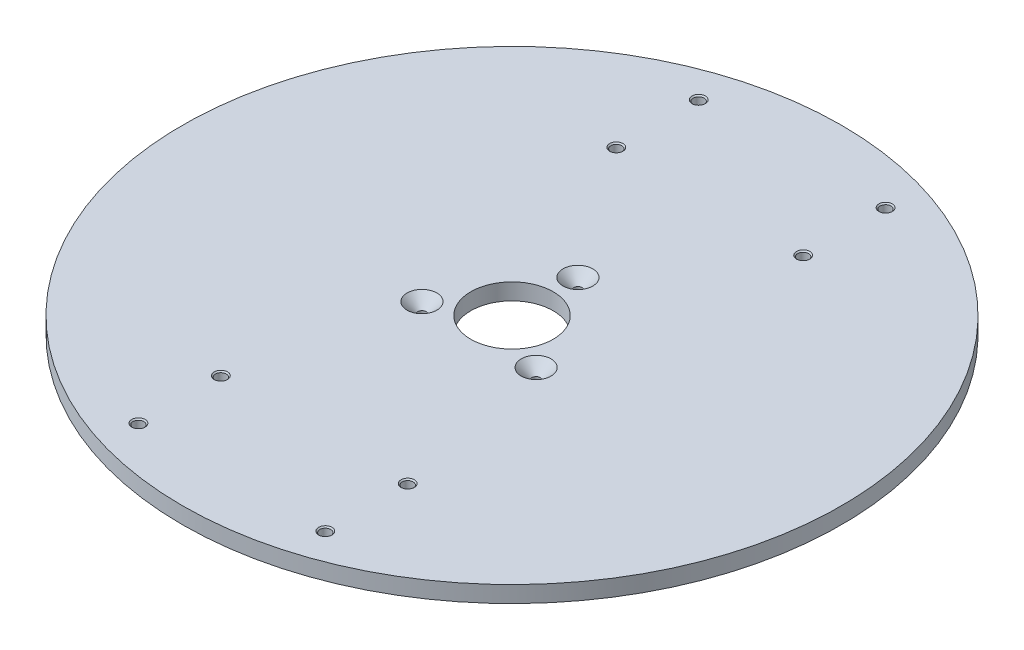
ISO-10303-21;
HEADER;
FILE_DESCRIPTION(('STEP AP214'),'2;1');
FILE_NAME('part.step','',(''),(''),'','','');
FILE_SCHEMA(('AUTOMOTIVE_DESIGN { 1 0 10303 214 1 1 1 1 }'));
ENDSEC;
DATA;
#1=APPLICATION_CONTEXT('core data for automotive mechanical design processes');
#2=APPLICATION_PROTOCOL_DEFINITION('international standard','automotive_design',2000,#1);
#3=PRODUCT_CONTEXT('',#1,'mechanical');
#4=PRODUCT('Part','Part','',(#3));
#5=PRODUCT_RELATED_PRODUCT_CATEGORY('part','',(#4));
#6=PRODUCT_DEFINITION_FORMATION('','',#4);
#7=PRODUCT_DEFINITION_CONTEXT('part definition',#1,'design');
#8=PRODUCT_DEFINITION('design','',#6,#7);
#9=PRODUCT_DEFINITION_SHAPE('','',#8);
#10=(LENGTH_UNIT() NAMED_UNIT(*) SI_UNIT(.MILLI.,.METRE.));
#11=(NAMED_UNIT(*) PLANE_ANGLE_UNIT() SI_UNIT($,.RADIAN.));
#12=(NAMED_UNIT(*) SI_UNIT($,.STERADIAN.) SOLID_ANGLE_UNIT());
#13=UNCERTAINTY_MEASURE_WITH_UNIT(LENGTH_MEASURE(1.E-05),#10,'distance_accuracy_value','');
#14=(GEOMETRIC_REPRESENTATION_CONTEXT(3) GLOBAL_UNCERTAINTY_ASSIGNED_CONTEXT((#13)) GLOBAL_UNIT_ASSIGNED_CONTEXT((#10,
#11,#12)) REPRESENTATION_CONTEXT('',''));
#15=CARTESIAN_POINT('',(0.,0.,0.));
#16=DIRECTION('',(0.,0.,1.));
#17=DIRECTION('',(1.,0.,0.));
#18=AXIS2_PLACEMENT_3D('',#15,#16,#17);
#19=CARTESIAN_POINT('',(0.,5.,0.));
#20=DIRECTION('',(0.,-1.,0.));
#21=DIRECTION('',(0.,0.,-1.));
#22=AXIS2_PLACEMENT_3D('',#19,#20,#21);
#23=CYLINDRICAL_SURFACE('',#22,100.);
#24=CARTESIAN_POINT('',(0.,5.,0.));
#25=DIRECTION('',(0.,1.,0.));
#26=DIRECTION('',(0.,0.,1.));
#27=AXIS2_PLACEMENT_3D('',#24,#25,#26);
#28=CIRCLE('',#27,100.);
#29=CARTESIAN_POINT('',(0.,5.,100.));
#30=VERTEX_POINT('',#29);
#31=EDGE_CURVE('E10',#30,#30,#28,.T.);
#32=ORIENTED_EDGE('',*,*,#31,.F.);
#33=EDGE_LOOP('',(#32));
#34=FACE_BOUND('',#33,.T.);
#35=CARTESIAN_POINT('',(0.,0.,0.));
#36=DIRECTION('',(0.,1.,0.));
#37=DIRECTION('',(0.,0.,1.));
#38=AXIS2_PLACEMENT_3D('',#35,#36,#37);
#39=CIRCLE('',#38,100.);
#40=CARTESIAN_POINT('',(0.,0.,100.));
#41=VERTEX_POINT('',#40);
#42=EDGE_CURVE('E42',#41,#41,#39,.T.);
#43=ORIENTED_EDGE('',*,*,#42,.T.);
#44=EDGE_LOOP('',(#43));
#45=FACE_BOUND('',#44,.T.);
#46=ADVANCED_FACE('F39',(#34,#45),#23,.T.);
#47=CARTESIAN_POINT('',(0.,5.,0.));
#48=DIRECTION('',(0.,1.,0.));
#49=DIRECTION('',(0.,0.,1.));
#50=AXIS2_PLACEMENT_3D('',#47,#48,#49);
#51=PLANE('',#50);
#52=CARTESIAN_POINT('',(-28.35,5.,-85.));
#53=DIRECTION('',(0.,1.,0.));
#54=DIRECTION('',(0.,0.,1.));
#55=AXIS2_PLACEMENT_3D('',#52,#53,#54);
#56=CIRCLE('',#55,2.025);
#57=CARTESIAN_POINT('',(-28.35,5.,-82.975));
#58=VERTEX_POINT('',#57);
#59=EDGE_CURVE('E152',#58,#58,#56,.T.);
#60=ORIENTED_EDGE('',*,*,#59,.F.);
#61=EDGE_LOOP('',(#60));
#62=FACE_BOUND('',#61,.T.);
#63=CARTESIAN_POINT('',(28.35,5.,-85.));
#64=DIRECTION('',(0.,1.,0.));
#65=DIRECTION('',(0.,0.,1.));
#66=AXIS2_PLACEMENT_3D('',#63,#64,#65);
#67=CIRCLE('',#66,2.025);
#68=CARTESIAN_POINT('',(28.35,5.,-82.975));
#69=VERTEX_POINT('',#68);
#70=EDGE_CURVE('E143',#69,#69,#67,.T.);
#71=ORIENTED_EDGE('',*,*,#70,.F.);
#72=EDGE_LOOP('',(#71));
#73=FACE_BOUND('',#72,.T.);
#74=CARTESIAN_POINT('',(28.35,5.,85.));
#75=DIRECTION('',(0.,1.,0.));
#76=DIRECTION('',(0.,0.,1.));
#77=AXIS2_PLACEMENT_3D('',#74,#75,#76);
#78=CIRCLE('',#77,2.025);
#79=CARTESIAN_POINT('',(28.35,5.,87.025));
#80=VERTEX_POINT('',#79);
#81=EDGE_CURVE('E134',#80,#80,#78,.T.);
#82=ORIENTED_EDGE('',*,*,#81,.F.);
#83=EDGE_LOOP('',(#82));
#84=FACE_BOUND('',#83,.T.);
#85=CARTESIAN_POINT('',(-28.35,5.,85.));
#86=DIRECTION('',(0.,1.,0.));
#87=DIRECTION('',(0.,0.,1.));
#88=AXIS2_PLACEMENT_3D('',#85,#86,#87);
#89=CIRCLE('',#88,2.025);
#90=CARTESIAN_POINT('',(-28.35,5.,87.025));
#91=VERTEX_POINT('',#90);
#92=EDGE_CURVE('E125',#91,#91,#89,.T.);
#93=ORIENTED_EDGE('',*,*,#92,.F.);
#94=EDGE_LOOP('',(#93));
#95=FACE_BOUND('',#94,.T.);
#96=CARTESIAN_POINT('',(-28.35,5.,-60.));
#97=DIRECTION('',(0.,1.,0.));
#98=DIRECTION('',(0.,0.,1.));
#99=AXIS2_PLACEMENT_3D('',#96,#97,#98);
#100=CIRCLE('',#99,2.025);
#101=CARTESIAN_POINT('',(-28.35,5.,-57.975));
#102=VERTEX_POINT('',#101);
#103=EDGE_CURVE('E116',#102,#102,#100,.T.);
#104=ORIENTED_EDGE('',*,*,#103,.F.);
#105=EDGE_LOOP('',(#104));
#106=FACE_BOUND('',#105,.T.);
#107=CARTESIAN_POINT('',(28.35,5.,-60.));
#108=DIRECTION('',(0.,1.,0.));
#109=DIRECTION('',(0.,0.,1.));
#110=AXIS2_PLACEMENT_3D('',#107,#108,#109);
#111=CIRCLE('',#110,2.025);
#112=CARTESIAN_POINT('',(28.35,5.,-57.975));
#113=VERTEX_POINT('',#112);
#114=EDGE_CURVE('E107',#113,#113,#111,.T.);
#115=ORIENTED_EDGE('',*,*,#114,.F.);
#116=EDGE_LOOP('',(#115));
#117=FACE_BOUND('',#116,.T.);
#118=CARTESIAN_POINT('',(-28.35,5.,60.));
#119=DIRECTION('',(0.,1.,0.));
#120=DIRECTION('',(0.,0.,1.));
#121=AXIS2_PLACEMENT_3D('',#118,#119,#120);
#122=CIRCLE('',#121,2.025);
#123=CARTESIAN_POINT('',(-28.35,5.,62.025));
#124=VERTEX_POINT('',#123);
#125=EDGE_CURVE('E98',#124,#124,#122,.T.);
#126=ORIENTED_EDGE('',*,*,#125,.F.);
#127=EDGE_LOOP('',(#126));
#128=FACE_BOUND('',#127,.T.);
#129=CARTESIAN_POINT('',(28.35,5.,60.));
#130=DIRECTION('',(0.,1.,0.));
#131=DIRECTION('',(0.,0.,1.));
#132=AXIS2_PLACEMENT_3D('',#129,#130,#131);
#133=CIRCLE('',#132,2.025);
#134=CARTESIAN_POINT('',(28.35,5.,62.025));
#135=VERTEX_POINT('',#134);
#136=EDGE_CURVE('E89',#135,#135,#133,.T.);
#137=ORIENTED_EDGE('',*,*,#136,.F.);
#138=EDGE_LOOP('',(#137));
#139=FACE_BOUND('',#138,.T.);
#140=CARTESIAN_POINT('',(0.,5.,0.));
#141=DIRECTION('',(0.,1.,0.));
#142=DIRECTION('',(0.,0.,1.));
#143=AXIS2_PLACEMENT_3D('',#140,#141,#142);
#144=CIRCLE('',#143,12.5);
#145=CARTESIAN_POINT('',(0.,5.,12.5));
#146=VERTEX_POINT('',#145);
#147=EDGE_CURVE('E78',#146,#146,#144,.T.);
#148=ORIENTED_EDGE('',*,*,#147,.F.);
#149=EDGE_LOOP('',(#148));
#150=FACE_BOUND('',#149,.T.);
#151=CARTESIAN_POINT('',(0.,5.,-20.));
#152=DIRECTION('',(0.,1.,0.));
#153=DIRECTION('',(0.,0.,1.));
#154=AXIS2_PLACEMENT_3D('',#151,#152,#153);
#155=CIRCLE('',#154,4.525);
#156=CARTESIAN_POINT('',(0.,5.,-15.475));
#157=VERTEX_POINT('',#156);
#158=EDGE_CURVE('E74',#157,#157,#155,.T.);
#159=ORIENTED_EDGE('',*,*,#158,.F.);
#160=EDGE_LOOP('',(#159));
#161=FACE_BOUND('',#160,.T.);
#162=CARTESIAN_POINT('',(17.3205080756888,5.,9.99999999999996));
#163=DIRECTION('',(0.,1.,0.));
#164=DIRECTION('',(0.,0.,1.));
#165=AXIS2_PLACEMENT_3D('',#162,#163,#164);
#166=CIRCLE('',#165,4.525);
#167=CARTESIAN_POINT('',(17.3205080756888,5.,14.525));
#168=VERTEX_POINT('',#167);
#169=EDGE_CURVE('E65',#168,#168,#166,.T.);
#170=ORIENTED_EDGE('',*,*,#169,.F.);
#171=EDGE_LOOP('',(#170));
#172=FACE_BOUND('',#171,.T.);
#173=CARTESIAN_POINT('',(-17.3205080756888,5.,9.99999999999997));
#174=DIRECTION('',(0.,1.,0.));
#175=DIRECTION('',(0.,0.,1.));
#176=AXIS2_PLACEMENT_3D('',#173,#174,#175);
#177=CIRCLE('',#176,4.525);
#178=CARTESIAN_POINT('',(-17.3205080756888,5.,14.525));
#179=VERTEX_POINT('',#178);
#180=EDGE_CURVE('E56',#179,#179,#177,.T.);
#181=ORIENTED_EDGE('',*,*,#180,.F.);
#182=EDGE_LOOP('',(#181));
#183=FACE_BOUND('',#182,.T.);
#184=ORIENTED_EDGE('',*,*,#31,.T.);
#185=EDGE_LOOP('',(#184));
#186=FACE_BOUND('',#185,.T.);
#187=ADVANCED_FACE('F158',(#62,#73,#84,#95,#106,#117,#128,#139,#150,#161,#172,#183,#186),#51,.T.);
#188=CARTESIAN_POINT('',(0.,0.,0.));
#189=DIRECTION('',(0.,1.,0.));
#190=DIRECTION('',(0.,0.,1.));
#191=AXIS2_PLACEMENT_3D('',#188,#189,#190);
#192=PLANE('',#191);
#193=CARTESIAN_POINT('',(-28.35,0.,-85.));
#194=DIRECTION('',(0.,1.,0.));
#195=DIRECTION('',(0.,0.,1.));
#196=AXIS2_PLACEMENT_3D('',#193,#194,#195);
#197=CIRCLE('',#196,1.64999999999999);
#198=CARTESIAN_POINT('',(-28.35,0.,-83.35));
#199=VERTEX_POINT('',#198);
#200=EDGE_CURVE('E146',#199,#199,#197,.T.);
#201=ORIENTED_EDGE('',*,*,#200,.T.);
#202=EDGE_LOOP('',(#201));
#203=FACE_BOUND('',#202,.T.);
#204=CARTESIAN_POINT('',(28.35,0.,-85.));
#205=DIRECTION('',(0.,1.,0.));
#206=DIRECTION('',(0.,0.,1.));
#207=AXIS2_PLACEMENT_3D('',#204,#205,#206);
#208=CIRCLE('',#207,1.64999999999999);
#209=CARTESIAN_POINT('',(28.35,0.,-83.35));
#210=VERTEX_POINT('',#209);
#211=EDGE_CURVE('E137',#210,#210,#208,.T.);
#212=ORIENTED_EDGE('',*,*,#211,.T.);
#213=EDGE_LOOP('',(#212));
#214=FACE_BOUND('',#213,.T.);
#215=CARTESIAN_POINT('',(28.35,0.,85.));
#216=DIRECTION('',(0.,1.,0.));
#217=DIRECTION('',(0.,0.,1.));
#218=AXIS2_PLACEMENT_3D('',#215,#216,#217);
#219=CIRCLE('',#218,1.64999999999999);
#220=CARTESIAN_POINT('',(28.35,0.,86.65));
#221=VERTEX_POINT('',#220);
#222=EDGE_CURVE('E128',#221,#221,#219,.T.);
#223=ORIENTED_EDGE('',*,*,#222,.T.);
#224=EDGE_LOOP('',(#223));
#225=FACE_BOUND('',#224,.T.);
#226=CARTESIAN_POINT('',(-28.35,0.,85.));
#227=DIRECTION('',(0.,1.,0.));
#228=DIRECTION('',(0.,0.,1.));
#229=AXIS2_PLACEMENT_3D('',#226,#227,#228);
#230=CIRCLE('',#229,1.64999999999999);
#231=CARTESIAN_POINT('',(-28.35,0.,86.65));
#232=VERTEX_POINT('',#231);
#233=EDGE_CURVE('E119',#232,#232,#230,.T.);
#234=ORIENTED_EDGE('',*,*,#233,.T.);
#235=EDGE_LOOP('',(#234));
#236=FACE_BOUND('',#235,.T.);
#237=CARTESIAN_POINT('',(-28.35,0.,-60.));
#238=DIRECTION('',(0.,1.,0.));
#239=DIRECTION('',(0.,0.,1.));
#240=AXIS2_PLACEMENT_3D('',#237,#238,#239);
#241=CIRCLE('',#240,1.64999999999999);
#242=CARTESIAN_POINT('',(-28.35,0.,-58.35));
#243=VERTEX_POINT('',#242);
#244=EDGE_CURVE('E110',#243,#243,#241,.T.);
#245=ORIENTED_EDGE('',*,*,#244,.T.);
#246=EDGE_LOOP('',(#245));
#247=FACE_BOUND('',#246,.T.);
#248=CARTESIAN_POINT('',(28.35,0.,-60.));
#249=DIRECTION('',(0.,1.,0.));
#250=DIRECTION('',(0.,0.,1.));
#251=AXIS2_PLACEMENT_3D('',#248,#249,#250);
#252=CIRCLE('',#251,1.64999999999999);
#253=CARTESIAN_POINT('',(28.35,0.,-58.35));
#254=VERTEX_POINT('',#253);
#255=EDGE_CURVE('E101',#254,#254,#252,.T.);
#256=ORIENTED_EDGE('',*,*,#255,.T.);
#257=EDGE_LOOP('',(#256));
#258=FACE_BOUND('',#257,.T.);
#259=CARTESIAN_POINT('',(-28.35,0.,60.));
#260=DIRECTION('',(0.,1.,0.));
#261=DIRECTION('',(0.,0.,1.));
#262=AXIS2_PLACEMENT_3D('',#259,#260,#261);
#263=CIRCLE('',#262,1.64999999999999);
#264=CARTESIAN_POINT('',(-28.35,0.,61.65));
#265=VERTEX_POINT('',#264);
#266=EDGE_CURVE('E92',#265,#265,#263,.T.);
#267=ORIENTED_EDGE('',*,*,#266,.T.);
#268=EDGE_LOOP('',(#267));
#269=FACE_BOUND('',#268,.T.);
#270=CARTESIAN_POINT('',(28.35,0.,60.));
#271=DIRECTION('',(0.,1.,0.));
#272=DIRECTION('',(0.,0.,1.));
#273=AXIS2_PLACEMENT_3D('',#270,#271,#272);
#274=CIRCLE('',#273,1.64999999999999);
#275=CARTESIAN_POINT('',(28.35,0.,61.65));
#276=VERTEX_POINT('',#275);
#277=EDGE_CURVE('E81',#276,#276,#274,.T.);
#278=ORIENTED_EDGE('',*,*,#277,.T.);
#279=EDGE_LOOP('',(#278));
#280=FACE_BOUND('',#279,.T.);
#281=CARTESIAN_POINT('',(0.,0.,0.));
#282=DIRECTION('',(0.,1.,0.));
#283=DIRECTION('',(0.,0.,1.));
#284=AXIS2_PLACEMENT_3D('',#281,#282,#283);
#285=CIRCLE('',#284,12.5);
#286=CARTESIAN_POINT('',(0.,0.,12.5));
#287=VERTEX_POINT('',#286);
#288=EDGE_CURVE('E77',#287,#287,#285,.T.);
#289=ORIENTED_EDGE('',*,*,#288,.T.);
#290=EDGE_LOOP('',(#289));
#291=FACE_BOUND('',#290,.T.);
#292=CARTESIAN_POINT('',(0.,0.,-20.));
#293=DIRECTION('',(0.,1.,0.));
#294=DIRECTION('',(0.,0.,1.));
#295=AXIS2_PLACEMENT_3D('',#292,#293,#294);
#296=CIRCLE('',#295,1.25);
#297=CARTESIAN_POINT('',(0.,0.,-18.75));
#298=VERTEX_POINT('',#297);
#299=EDGE_CURVE('E68',#298,#298,#296,.T.);
#300=ORIENTED_EDGE('',*,*,#299,.T.);
#301=EDGE_LOOP('',(#300));
#302=FACE_BOUND('',#301,.T.);
#303=CARTESIAN_POINT('',(17.3205080756888,0.,9.99999999999996));
#304=DIRECTION('',(0.,1.,0.));
#305=DIRECTION('',(0.,0.,1.));
#306=AXIS2_PLACEMENT_3D('',#303,#304,#305);
#307=CIRCLE('',#306,1.25);
#308=CARTESIAN_POINT('',(17.3205080756888,0.,11.25));
#309=VERTEX_POINT('',#308);
#310=EDGE_CURVE('E59',#309,#309,#307,.T.);
#311=ORIENTED_EDGE('',*,*,#310,.T.);
#312=EDGE_LOOP('',(#311));
#313=FACE_BOUND('',#312,.T.);
#314=CARTESIAN_POINT('',(-17.3205080756888,0.,9.99999999999997));
#315=DIRECTION('',(0.,1.,0.));
#316=DIRECTION('',(0.,0.,1.));
#317=AXIS2_PLACEMENT_3D('',#314,#315,#316);
#318=CIRCLE('',#317,1.25);
#319=CARTESIAN_POINT('',(-17.3205080756888,0.,11.25));
#320=VERTEX_POINT('',#319);
#321=EDGE_CURVE('E49',#320,#320,#318,.T.);
#322=ORIENTED_EDGE('',*,*,#321,.T.);
#323=EDGE_LOOP('',(#322));
#324=FACE_BOUND('',#323,.T.);
#325=ORIENTED_EDGE('',*,*,#42,.F.);
#326=EDGE_LOOP('',(#325));
#327=FACE_BOUND('',#326,.T.);
#328=ADVANCED_FACE('F161',(#203,#214,#225,#236,#247,#258,#269,#280,#291,#302,#313,#324,#327),
#192,.F.);
#329=CARTESIAN_POINT('',(-17.3205080756888,5.,9.99999999999997));
#330=DIRECTION('',(0.,1.,0.));
#331=DIRECTION('',(0.,0.,1.));
#332=AXIS2_PLACEMENT_3D('',#329,#330,#331);
#333=CYLINDRICAL_SURFACE('',#332,1.25);
#334=ORIENTED_EDGE('',*,*,#321,.F.);
#335=EDGE_LOOP('',(#334));
#336=FACE_BOUND('',#335,.T.);
#337=CARTESIAN_POINT('',(-17.3205080756888,1.725,9.99999999999997));
#338=DIRECTION('',(0.,1.,0.));
#339=DIRECTION('',(0.,0.,1.));
#340=AXIS2_PLACEMENT_3D('',#337,#338,#339);
#341=CIRCLE('',#340,1.25);
#342=CARTESIAN_POINT('',(-17.3205080756888,1.725,11.25));
#343=VERTEX_POINT('',#342);
#344=EDGE_CURVE('E53',#343,#343,#341,.T.);
#345=ORIENTED_EDGE('',*,*,#344,.T.);
#346=EDGE_LOOP('',(#345));
#347=FACE_BOUND('',#346,.T.);
#348=ADVANCED_FACE('F188',(#336,#347),#333,.F.);
#349=CARTESIAN_POINT('',(-17.3205080756888,5.,9.99999999999997));
#350=DIRECTION('',(0.,1.,0.));
#351=DIRECTION('',(0.,0.,1.));
#352=AXIS2_PLACEMENT_3D('',#349,#350,#351);
#353=CONICAL_SURFACE('',#352,4.525,0.785398163397449);
#354=CARTESIAN_POINT('',(-17.3205080756888,1.725,11.25));
#355=CARTESIAN_POINT('',(-17.3205080756888,1.75911458333333,11.2841145833333));
#356=CARTESIAN_POINT('',(-17.3205080756888,1.79322916666667,11.3182291666666));
#357=CARTESIAN_POINT('',(-17.3205080756888,1.86145833333333,11.3864583333333));
#358=CARTESIAN_POINT('',(-17.3205080756888,1.89557291666667,11.4205729166666));
#359=CARTESIAN_POINT('',(-17.3205080756888,1.96380208333333,11.4888020833333));
#360=CARTESIAN_POINT('',(-17.3205080756888,1.99791666666667,11.5229166666666));
#361=CARTESIAN_POINT('',(-17.3205080756888,2.06614583333333,11.5911458333333));
#362=CARTESIAN_POINT('',(-17.3205080756888,2.10026041666667,11.6252604166666));
#363=CARTESIAN_POINT('',(-17.3205080756888,2.16848958333333,11.6934895833333));
#364=CARTESIAN_POINT('',(-17.3205080756888,2.20260416666667,11.7276041666666));
#365=CARTESIAN_POINT('',(-17.3205080756888,2.27083333333333,11.7958333333333));
#366=CARTESIAN_POINT('',(-17.3205080756888,2.30494791666667,11.8299479166666));
#367=CARTESIAN_POINT('',(-17.3205080756888,2.37317708333333,11.8981770833333));
#368=CARTESIAN_POINT('',(-17.3205080756888,2.40729166666667,11.9322916666666));
#369=CARTESIAN_POINT('',(-17.3205080756888,2.47552083333333,12.0005208333333));
#370=CARTESIAN_POINT('',(-17.3205080756888,2.50963541666667,12.0346354166666));
#371=CARTESIAN_POINT('',(-17.3205080756888,2.57786458333333,12.1028645833333));
#372=CARTESIAN_POINT('',(-17.3205080756888,2.61197916666667,12.1369791666666));
#373=CARTESIAN_POINT('',(-17.3205080756888,2.68020833333333,12.2052083333333));
#374=CARTESIAN_POINT('',(-17.3205080756888,2.71432291666667,12.2393229166666));
#375=CARTESIAN_POINT('',(-17.3205080756888,2.78255208333333,12.3075520833333));
#376=CARTESIAN_POINT('',(-17.3205080756888,2.81666666666667,12.3416666666666));
#377=CARTESIAN_POINT('',(-17.3205080756888,2.88489583333333,12.4098958333333));
#378=CARTESIAN_POINT('',(-17.3205080756888,2.91901041666667,12.4440104166666));
#379=CARTESIAN_POINT('',(-17.3205080756888,2.98723958333333,12.5122395833333));
#380=CARTESIAN_POINT('',(-17.3205080756888,3.02135416666667,12.5463541666666));
#381=CARTESIAN_POINT('',(-17.3205080756888,3.08958333333333,12.6145833333333));
#382=CARTESIAN_POINT('',(-17.3205080756888,3.12369791666667,12.6486979166666));
#383=CARTESIAN_POINT('',(-17.3205080756888,3.19192708333333,12.7169270833333));
#384=CARTESIAN_POINT('',(-17.3205080756888,3.22604166666667,12.7510416666666));
#385=CARTESIAN_POINT('',(-17.3205080756888,3.29427083333333,12.8192708333333));
#386=CARTESIAN_POINT('',(-17.3205080756888,3.32838541666667,12.8533854166666));
#387=CARTESIAN_POINT('',(-17.3205080756888,3.39661458333333,12.9216145833333));
#388=CARTESIAN_POINT('',(-17.3205080756888,3.43072916666667,12.9557291666666));
#389=CARTESIAN_POINT('',(-17.3205080756888,3.49895833333333,13.0239583333333));
#390=CARTESIAN_POINT('',(-17.3205080756888,3.53307291666667,13.0580729166666));
#391=CARTESIAN_POINT('',(-17.3205080756888,3.60130208333333,13.1263020833333));
#392=CARTESIAN_POINT('',(-17.3205080756888,3.63541666666667,13.1604166666666));
#393=CARTESIAN_POINT('',(-17.3205080756888,3.70364583333333,13.2286458333333));
#394=CARTESIAN_POINT('',(-17.3205080756888,3.73776041666667,13.2627604166666));
#395=CARTESIAN_POINT('',(-17.3205080756888,3.80598958333333,13.3309895833333));
#396=CARTESIAN_POINT('',(-17.3205080756888,3.84010416666667,13.3651041666666));
#397=CARTESIAN_POINT('',(-17.3205080756888,3.90833333333333,13.4333333333333));
#398=CARTESIAN_POINT('',(-17.3205080756888,3.94244791666667,13.4674479166666));
#399=CARTESIAN_POINT('',(-17.3205080756888,4.01067708333333,13.5356770833333));
#400=CARTESIAN_POINT('',(-17.3205080756888,4.04479166666667,13.5697916666666));
#401=CARTESIAN_POINT('',(-17.3205080756888,4.11302083333333,13.6380208333333));
#402=CARTESIAN_POINT('',(-17.3205080756888,4.14713541666667,13.6721354166666));
#403=CARTESIAN_POINT('',(-17.3205080756888,4.21536458333333,13.7403645833333));
#404=CARTESIAN_POINT('',(-17.3205080756888,4.24947916666667,13.7744791666666));
#405=CARTESIAN_POINT('',(-17.3205080756888,4.31770833333333,13.8427083333333));
#406=CARTESIAN_POINT('',(-17.3205080756888,4.35182291666667,13.8768229166666));
#407=CARTESIAN_POINT('',(-17.3205080756888,4.42005208333333,13.9450520833333));
#408=CARTESIAN_POINT('',(-17.3205080756888,4.45416666666667,13.9791666666666));
#409=CARTESIAN_POINT('',(-17.3205080756888,4.52239583333333,14.0473958333333));
#410=CARTESIAN_POINT('',(-17.3205080756888,4.55651041666667,14.0815104166666));
#411=CARTESIAN_POINT('',(-17.3205080756888,4.62473958333333,14.1497395833333));
#412=CARTESIAN_POINT('',(-17.3205080756888,4.65885416666667,14.1838541666666));
#413=CARTESIAN_POINT('',(-17.3205080756888,4.72708333333333,14.2520833333333));
#414=CARTESIAN_POINT('',(-17.3205080756888,4.76119791666667,14.2861979166666));
#415=CARTESIAN_POINT('',(-17.3205080756888,4.82942708333333,14.3544270833333));
#416=CARTESIAN_POINT('',(-17.3205080756888,4.86354166666667,14.3885416666666));
#417=CARTESIAN_POINT('',(-17.3205080756888,4.93177083333333,14.4567708333333));
#418=CARTESIAN_POINT('',(-17.3205080756888,4.96588541666667,14.4908854166666));
#419=CARTESIAN_POINT('',(-17.3205080756888,5.,14.525));
#420=B_SPLINE_CURVE_WITH_KNOTS('',3,(#354,#355,#356,#357,#358,#359,#360,#361,#362,#363,#364,
#365,#366,#367,#368,#369,#370,#371,#372,#373,#374,#375,#376,#377,#378,#379,#380,#381,#382,#383,
#384,#385,#386,#387,#388,#389,#390,#391,#392,#393,#394,#395,#396,#397,#398,#399,#400,#401,#402,
#403,#404,#405,#406,#407,#408,#409,#410,#411,#412,#413,#414,#415,#416,#417,#418,#419),
.UNSPECIFIED.,.F.,.F.,(4,2,2,2,2,2,2,2,2,2,2,2,2,2,2,2,2,2,2,2,2,2,2,2,2,2,2,2,2,2,2,2,4),(0.,
0.144735919274121,0.289471838548243,0.434207757822365,0.578943677096486,0.723679596370608,
0.868415515644729,1.01315143491885,1.15788735419297,1.30262327346709,1.44735919274121,
1.59209511201534,1.73683103128946,1.88156695056358,2.0263028698377,2.17103878911182,
2.31577470838594,2.46051062766007,2.60524654693419,2.74998246620831,2.89471838548243,
3.03945430475655,3.18419022403067,3.32892614330479,3.47366206257892,3.61839798185304,
3.76313390112716,3.90786982040128,4.0526057396754,4.19734165894952,4.34207757822364,
4.48681349749777,4.63154941677189),.UNSPECIFIED.);
#421=EDGE_CURVE('BSEAM185',#343,#179,#420,.T.);
#422=ORIENTED_EDGE('',*,*,#344,.F.);
#423=ORIENTED_EDGE('',*,*,#180,.T.);
#424=ORIENTED_EDGE('',*,*,#421,.T.);
#425=ORIENTED_EDGE('',*,*,#421,.F.);
#426=EDGE_LOOP('',(#422,#424,#423,#425));
#427=FACE_BOUND('',#426,.T.);
#428=ADVANCED_FACE('F185',(#427),#353,.F.);
#429=CARTESIAN_POINT('',(17.3205080756888,5.,9.99999999999996));
#430=DIRECTION('',(0.,1.,0.));
#431=DIRECTION('',(0.,0.,1.));
#432=AXIS2_PLACEMENT_3D('',#429,#430,#431);
#433=CYLINDRICAL_SURFACE('',#432,1.25);
#434=ORIENTED_EDGE('',*,*,#310,.F.);
#435=EDGE_LOOP('',(#434));
#436=FACE_BOUND('',#435,.T.);
#437=CARTESIAN_POINT('',(17.3205080756888,1.725,9.99999999999996));
#438=DIRECTION('',(0.,1.,0.));
#439=DIRECTION('',(0.,0.,1.));
#440=AXIS2_PLACEMENT_3D('',#437,#438,#439);
#441=CIRCLE('',#440,1.25);
#442=CARTESIAN_POINT('',(17.3205080756888,1.725,11.25));
#443=VERTEX_POINT('',#442);
#444=EDGE_CURVE('E62',#443,#443,#441,.T.);
#445=ORIENTED_EDGE('',*,*,#444,.T.);
#446=EDGE_LOOP('',(#445));
#447=FACE_BOUND('',#446,.T.);
#448=ADVANCED_FACE('F187',(#436,#447),#433,.F.);
#449=CARTESIAN_POINT('',(17.3205080756888,5.,9.99999999999996));
#450=DIRECTION('',(0.,1.,0.));
#451=DIRECTION('',(0.,0.,1.));
#452=AXIS2_PLACEMENT_3D('',#449,#450,#451);
#453=CONICAL_SURFACE('',#452,4.525,0.785398163397449);
#454=CARTESIAN_POINT('',(17.3205080756888,1.725,11.25));
#455=CARTESIAN_POINT('',(17.3205080756888,1.75911458333333,11.2841145833333));
#456=CARTESIAN_POINT('',(17.3205080756888,1.79322916666667,11.3182291666666));
#457=CARTESIAN_POINT('',(17.3205080756888,1.86145833333333,11.3864583333333));
#458=CARTESIAN_POINT('',(17.3205080756888,1.89557291666667,11.4205729166666));
#459=CARTESIAN_POINT('',(17.3205080756888,1.96380208333333,11.4888020833333));
#460=CARTESIAN_POINT('',(17.3205080756888,1.99791666666667,11.5229166666666));
#461=CARTESIAN_POINT('',(17.3205080756888,2.06614583333333,11.5911458333333));
#462=CARTESIAN_POINT('',(17.3205080756888,2.10026041666667,11.6252604166666));
#463=CARTESIAN_POINT('',(17.3205080756888,2.16848958333333,11.6934895833333));
#464=CARTESIAN_POINT('',(17.3205080756888,2.20260416666667,11.7276041666666));
#465=CARTESIAN_POINT('',(17.3205080756888,2.27083333333333,11.7958333333333));
#466=CARTESIAN_POINT('',(17.3205080756888,2.30494791666667,11.8299479166666));
#467=CARTESIAN_POINT('',(17.3205080756888,2.37317708333333,11.8981770833333));
#468=CARTESIAN_POINT('',(17.3205080756888,2.40729166666667,11.9322916666666));
#469=CARTESIAN_POINT('',(17.3205080756888,2.47552083333333,12.0005208333333));
#470=CARTESIAN_POINT('',(17.3205080756888,2.50963541666667,12.0346354166666));
#471=CARTESIAN_POINT('',(17.3205080756888,2.57786458333333,12.1028645833333));
#472=CARTESIAN_POINT('',(17.3205080756888,2.61197916666667,12.1369791666666));
#473=CARTESIAN_POINT('',(17.3205080756888,2.68020833333333,12.2052083333333));
#474=CARTESIAN_POINT('',(17.3205080756888,2.71432291666667,12.2393229166666));
#475=CARTESIAN_POINT('',(17.3205080756888,2.78255208333333,12.3075520833333));
#476=CARTESIAN_POINT('',(17.3205080756888,2.81666666666667,12.3416666666666));
#477=CARTESIAN_POINT('',(17.3205080756888,2.88489583333333,12.4098958333333));
#478=CARTESIAN_POINT('',(17.3205080756888,2.91901041666667,12.4440104166666));
#479=CARTESIAN_POINT('',(17.3205080756888,2.98723958333333,12.5122395833333));
#480=CARTESIAN_POINT('',(17.3205080756888,3.02135416666667,12.5463541666666));
#481=CARTESIAN_POINT('',(17.3205080756888,3.08958333333333,12.6145833333333));
#482=CARTESIAN_POINT('',(17.3205080756888,3.12369791666667,12.6486979166666));
#483=CARTESIAN_POINT('',(17.3205080756888,3.19192708333333,12.7169270833333));
#484=CARTESIAN_POINT('',(17.3205080756888,3.22604166666667,12.7510416666666));
#485=CARTESIAN_POINT('',(17.3205080756888,3.29427083333333,12.8192708333333));
#486=CARTESIAN_POINT('',(17.3205080756888,3.32838541666667,12.8533854166666));
#487=CARTESIAN_POINT('',(17.3205080756888,3.39661458333333,12.9216145833333));
#488=CARTESIAN_POINT('',(17.3205080756888,3.43072916666667,12.9557291666666));
#489=CARTESIAN_POINT('',(17.3205080756888,3.49895833333333,13.0239583333333));
#490=CARTESIAN_POINT('',(17.3205080756888,3.53307291666667,13.0580729166666));
#491=CARTESIAN_POINT('',(17.3205080756888,3.60130208333333,13.1263020833333));
#492=CARTESIAN_POINT('',(17.3205080756888,3.63541666666667,13.1604166666666));
#493=CARTESIAN_POINT('',(17.3205080756888,3.70364583333333,13.2286458333333));
#494=CARTESIAN_POINT('',(17.3205080756888,3.73776041666667,13.2627604166666));
#495=CARTESIAN_POINT('',(17.3205080756888,3.80598958333333,13.3309895833333));
#496=CARTESIAN_POINT('',(17.3205080756888,3.84010416666667,13.3651041666666));
#497=CARTESIAN_POINT('',(17.3205080756888,3.90833333333333,13.4333333333333));
#498=CARTESIAN_POINT('',(17.3205080756888,3.94244791666667,13.4674479166666));
#499=CARTESIAN_POINT('',(17.3205080756888,4.01067708333333,13.5356770833333));
#500=CARTESIAN_POINT('',(17.3205080756888,4.04479166666667,13.5697916666666));
#501=CARTESIAN_POINT('',(17.3205080756888,4.11302083333333,13.6380208333333));
#502=CARTESIAN_POINT('',(17.3205080756888,4.14713541666667,13.6721354166666));
#503=CARTESIAN_POINT('',(17.3205080756888,4.21536458333333,13.7403645833333));
#504=CARTESIAN_POINT('',(17.3205080756888,4.24947916666667,13.7744791666666));
#505=CARTESIAN_POINT('',(17.3205080756888,4.31770833333333,13.8427083333333));
#506=CARTESIAN_POINT('',(17.3205080756888,4.35182291666667,13.8768229166666));
#507=CARTESIAN_POINT('',(17.3205080756888,4.42005208333333,13.9450520833333));
#508=CARTESIAN_POINT('',(17.3205080756888,4.45416666666667,13.9791666666666));
#509=CARTESIAN_POINT('',(17.3205080756888,4.52239583333333,14.0473958333333));
#510=CARTESIAN_POINT('',(17.3205080756888,4.55651041666667,14.0815104166666));
#511=CARTESIAN_POINT('',(17.3205080756888,4.62473958333333,14.1497395833333));
#512=CARTESIAN_POINT('',(17.3205080756888,4.65885416666667,14.1838541666666));
#513=CARTESIAN_POINT('',(17.3205080756888,4.72708333333333,14.2520833333333));
#514=CARTESIAN_POINT('',(17.3205080756888,4.76119791666667,14.2861979166666));
#515=CARTESIAN_POINT('',(17.3205080756888,4.82942708333333,14.3544270833333));
#516=CARTESIAN_POINT('',(17.3205080756888,4.86354166666667,14.3885416666666));
#517=CARTESIAN_POINT('',(17.3205080756888,4.93177083333333,14.4567708333333));
#518=CARTESIAN_POINT('',(17.3205080756888,4.96588541666667,14.4908854166666));
#519=CARTESIAN_POINT('',(17.3205080756888,5.,14.525));
#520=B_SPLINE_CURVE_WITH_KNOTS('',3,(#454,#455,#456,#457,#458,#459,#460,#461,#462,#463,#464,
#465,#466,#467,#468,#469,#470,#471,#472,#473,#474,#475,#476,#477,#478,#479,#480,#481,#482,#483,
#484,#485,#486,#487,#488,#489,#490,#491,#492,#493,#494,#495,#496,#497,#498,#499,#500,#501,#502,
#503,#504,#505,#506,#507,#508,#509,#510,#511,#512,#513,#514,#515,#516,#517,#518,#519),
.UNSPECIFIED.,.F.,.F.,(4,2,2,2,2,2,2,2,2,2,2,2,2,2,2,2,2,2,2,2,2,2,2,2,2,2,2,2,2,2,2,2,4),(0.,
0.144735919274121,0.289471838548243,0.434207757822365,0.578943677096486,0.723679596370608,
0.868415515644729,1.01315143491885,1.15788735419297,1.30262327346709,1.44735919274121,
1.59209511201534,1.73683103128946,1.88156695056358,2.0263028698377,2.17103878911182,
2.31577470838594,2.46051062766007,2.60524654693419,2.74998246620831,2.89471838548243,
3.03945430475655,3.18419022403067,3.32892614330479,3.47366206257892,3.61839798185304,
3.76313390112716,3.90786982040128,4.0526057396754,4.19734165894952,4.34207757822364,
4.48681349749777,4.63154941677189),.UNSPECIFIED.);
#521=EDGE_CURVE('BSEAM196',#443,#168,#520,.T.);
#522=ORIENTED_EDGE('',*,*,#444,.F.);
#523=ORIENTED_EDGE('',*,*,#169,.T.);
#524=ORIENTED_EDGE('',*,*,#521,.T.);
#525=ORIENTED_EDGE('',*,*,#521,.F.);
#526=EDGE_LOOP('',(#522,#524,#523,#525));
#527=FACE_BOUND('',#526,.T.);
#528=ADVANCED_FACE('F196',(#527),#453,.F.);
#529=CARTESIAN_POINT('',(0.,5.,-20.));
#530=DIRECTION('',(0.,1.,0.));
#531=DIRECTION('',(0.,0.,1.));
#532=AXIS2_PLACEMENT_3D('',#529,#530,#531);
#533=CYLINDRICAL_SURFACE('',#532,1.25);
#534=ORIENTED_EDGE('',*,*,#299,.F.);
#535=EDGE_LOOP('',(#534));
#536=FACE_BOUND('',#535,.T.);
#537=CARTESIAN_POINT('',(0.,1.725,-20.));
#538=DIRECTION('',(0.,1.,0.));
#539=DIRECTION('',(0.,0.,1.));
#540=AXIS2_PLACEMENT_3D('',#537,#538,#539);
#541=CIRCLE('',#540,1.25);
#542=CARTESIAN_POINT('',(0.,1.725,-18.75));
#543=VERTEX_POINT('',#542);
#544=EDGE_CURVE('E71',#543,#543,#541,.T.);
#545=ORIENTED_EDGE('',*,*,#544,.T.);
#546=EDGE_LOOP('',(#545));
#547=FACE_BOUND('',#546,.T.);
#548=ADVANCED_FACE('F244',(#536,#547),#533,.F.);
#549=CARTESIAN_POINT('',(0.,5.,-20.));
#550=DIRECTION('',(0.,1.,0.));
#551=DIRECTION('',(0.,0.,1.));
#552=AXIS2_PLACEMENT_3D('',#549,#550,#551);
#553=CONICAL_SURFACE('',#552,4.525,0.785398163397449);
#554=CARTESIAN_POINT('',(0.,1.725,-18.75));
#555=CARTESIAN_POINT('',(0.,1.75911458333333,-18.7158854166667));
#556=CARTESIAN_POINT('',(0.,1.79322916666667,-18.6817708333333));
#557=CARTESIAN_POINT('',(0.,1.86145833333333,-18.6135416666667));
#558=CARTESIAN_POINT('',(0.,1.89557291666667,-18.5794270833333));
#559=CARTESIAN_POINT('',(0.,1.96380208333333,-18.5111979166667));
#560=CARTESIAN_POINT('',(0.,1.99791666666667,-18.4770833333333));
#561=CARTESIAN_POINT('',(0.,2.06614583333333,-18.4088541666667));
#562=CARTESIAN_POINT('',(0.,2.10026041666667,-18.3747395833333));
#563=CARTESIAN_POINT('',(0.,2.16848958333333,-18.3065104166667));
#564=CARTESIAN_POINT('',(0.,2.20260416666667,-18.2723958333333));
#565=CARTESIAN_POINT('',(0.,2.27083333333333,-18.2041666666667));
#566=CARTESIAN_POINT('',(0.,2.30494791666667,-18.1700520833333));
#567=CARTESIAN_POINT('',(0.,2.37317708333333,-18.1018229166667));
#568=CARTESIAN_POINT('',(0.,2.40729166666667,-18.0677083333333));
#569=CARTESIAN_POINT('',(0.,2.47552083333333,-17.9994791666667));
#570=CARTESIAN_POINT('',(0.,2.50963541666667,-17.9653645833333));
#571=CARTESIAN_POINT('',(0.,2.57786458333333,-17.8971354166667));
#572=CARTESIAN_POINT('',(0.,2.61197916666667,-17.8630208333333));
#573=CARTESIAN_POINT('',(0.,2.68020833333333,-17.7947916666667));
#574=CARTESIAN_POINT('',(0.,2.71432291666667,-17.7606770833333));
#575=CARTESIAN_POINT('',(0.,2.78255208333333,-17.6924479166667));
#576=CARTESIAN_POINT('',(0.,2.81666666666667,-17.6583333333333));
#577=CARTESIAN_POINT('',(0.,2.88489583333333,-17.5901041666667));
#578=CARTESIAN_POINT('',(0.,2.91901041666667,-17.5559895833333));
#579=CARTESIAN_POINT('',(0.,2.98723958333333,-17.4877604166667));
#580=CARTESIAN_POINT('',(0.,3.02135416666667,-17.4536458333333));
#581=CARTESIAN_POINT('',(0.,3.08958333333333,-17.3854166666667));
#582=CARTESIAN_POINT('',(0.,3.12369791666667,-17.3513020833333));
#583=CARTESIAN_POINT('',(0.,3.19192708333333,-17.2830729166667));
#584=CARTESIAN_POINT('',(0.,3.22604166666667,-17.2489583333333));
#585=CARTESIAN_POINT('',(0.,3.29427083333333,-17.1807291666667));
#586=CARTESIAN_POINT('',(0.,3.32838541666667,-17.1466145833333));
#587=CARTESIAN_POINT('',(0.,3.39661458333333,-17.0783854166667));
#588=CARTESIAN_POINT('',(0.,3.43072916666667,-17.0442708333333));
#589=CARTESIAN_POINT('',(0.,3.49895833333333,-16.9760416666667));
#590=CARTESIAN_POINT('',(0.,3.53307291666667,-16.9419270833333));
#591=CARTESIAN_POINT('',(0.,3.60130208333333,-16.8736979166667));
#592=CARTESIAN_POINT('',(0.,3.63541666666667,-16.8395833333333));
#593=CARTESIAN_POINT('',(0.,3.70364583333333,-16.7713541666667));
#594=CARTESIAN_POINT('',(0.,3.73776041666667,-16.7372395833333));
#595=CARTESIAN_POINT('',(0.,3.80598958333333,-16.6690104166667));
#596=CARTESIAN_POINT('',(0.,3.84010416666667,-16.6348958333333));
#597=CARTESIAN_POINT('',(0.,3.90833333333333,-16.5666666666667));
#598=CARTESIAN_POINT('',(0.,3.94244791666667,-16.5325520833333));
#599=CARTESIAN_POINT('',(0.,4.01067708333333,-16.4643229166667));
#600=CARTESIAN_POINT('',(0.,4.04479166666667,-16.4302083333333));
#601=CARTESIAN_POINT('',(0.,4.11302083333333,-16.3619791666667));
#602=CARTESIAN_POINT('',(0.,4.14713541666667,-16.3278645833333));
#603=CARTESIAN_POINT('',(0.,4.21536458333333,-16.2596354166667));
#604=CARTESIAN_POINT('',(0.,4.24947916666667,-16.2255208333333));
#605=CARTESIAN_POINT('',(0.,4.31770833333333,-16.1572916666667));
#606=CARTESIAN_POINT('',(0.,4.35182291666667,-16.1231770833333));
#607=CARTESIAN_POINT('',(0.,4.42005208333333,-16.0549479166667));
#608=CARTESIAN_POINT('',(0.,4.45416666666667,-16.0208333333333));
#609=CARTESIAN_POINT('',(0.,4.52239583333333,-15.9526041666667));
#610=CARTESIAN_POINT('',(0.,4.55651041666667,-15.9184895833333));
#611=CARTESIAN_POINT('',(0.,4.62473958333333,-15.8502604166667));
#612=CARTESIAN_POINT('',(0.,4.65885416666667,-15.8161458333333));
#613=CARTESIAN_POINT('',(0.,4.72708333333333,-15.7479166666667));
#614=CARTESIAN_POINT('',(0.,4.76119791666667,-15.7138020833333));
#615=CARTESIAN_POINT('',(0.,4.82942708333333,-15.6455729166667));
#616=CARTESIAN_POINT('',(0.,4.86354166666667,-15.6114583333333));
#617=CARTESIAN_POINT('',(0.,4.93177083333333,-15.5432291666667));
#618=CARTESIAN_POINT('',(0.,4.96588541666667,-15.5091145833333));
#619=CARTESIAN_POINT('',(0.,5.,-15.475));
#620=B_SPLINE_CURVE_WITH_KNOTS('',3,(#554,#555,#556,#557,#558,#559,#560,#561,#562,#563,#564,
#565,#566,#567,#568,#569,#570,#571,#572,#573,#574,#575,#576,#577,#578,#579,#580,#581,#582,#583,
#584,#585,#586,#587,#588,#589,#590,#591,#592,#593,#594,#595,#596,#597,#598,#599,#600,#601,#602,
#603,#604,#605,#606,#607,#608,#609,#610,#611,#612,#613,#614,#615,#616,#617,#618,#619),
.UNSPECIFIED.,.F.,.F.,(4,2,2,2,2,2,2,2,2,2,2,2,2,2,2,2,2,2,2,2,2,2,2,2,2,2,2,2,2,2,2,2,4),(0.,
0.144735919274122,0.289471838548244,0.434207757822366,0.578943677096486,0.723679596370608,
0.86841551564473,1.01315143491885,1.15788735419297,1.30262327346709,1.44735919274122,
1.59209511201534,1.73683103128946,1.88156695056358,2.0263028698377,2.17103878911182,
2.31577470838594,2.46051062766007,2.60524654693419,2.74998246620831,2.89471838548243,
3.03945430475655,3.18419022403067,3.32892614330479,3.47366206257891,3.61839798185304,
3.76313390112716,3.90786982040128,4.0526057396754,4.19734165894952,4.34207757822364,
4.48681349749777,4.63154941677189),.UNSPECIFIED.);
#621=EDGE_CURVE('BSEAM250',#543,#157,#620,.T.);
#622=ORIENTED_EDGE('',*,*,#544,.F.);
#623=ORIENTED_EDGE('',*,*,#158,.T.);
#624=ORIENTED_EDGE('',*,*,#621,.T.);
#625=ORIENTED_EDGE('',*,*,#621,.F.);
#626=EDGE_LOOP('',(#622,#624,#623,#625));
#627=FACE_BOUND('',#626,.T.);
#628=ADVANCED_FACE('F250',(#627),#553,.F.);
#629=CARTESIAN_POINT('',(0.,0.,0.));
#630=DIRECTION('',(0.,1.,0.));
#631=DIRECTION('',(0.,0.,1.));
#632=AXIS2_PLACEMENT_3D('',#629,#630,#631);
#633=CYLINDRICAL_SURFACE('',#632,12.5);
#634=ORIENTED_EDGE('',*,*,#288,.F.);
#635=EDGE_LOOP('',(#634));
#636=FACE_BOUND('',#635,.T.);
#637=ORIENTED_EDGE('',*,*,#147,.T.);
#638=EDGE_LOOP('',(#637));
#639=FACE_BOUND('',#638,.T.);
#640=ADVANCED_FACE('F256',(#636,#639),#633,.F.);
#641=CARTESIAN_POINT('',(28.35,5.,60.));
#642=DIRECTION('',(0.,1.,0.));
#643=DIRECTION('',(0.,0.,1.));
#644=AXIS2_PLACEMENT_3D('',#641,#642,#643);
#645=CYLINDRICAL_SURFACE('',#644,1.64999999999999);
#646=ORIENTED_EDGE('',*,*,#277,.F.);
#647=EDGE_LOOP('',(#646));
#648=FACE_BOUND('',#647,.T.);
#649=CARTESIAN_POINT('',(28.35,4.625,60.));
#650=DIRECTION('',(0.,1.,0.));
#651=DIRECTION('',(0.,0.,1.));
#652=AXIS2_PLACEMENT_3D('',#649,#650,#651);
#653=CIRCLE('',#652,1.64999999999999);
#654=CARTESIAN_POINT('',(28.35,4.625,61.65));
#655=VERTEX_POINT('',#654);
#656=EDGE_CURVE('E86',#655,#655,#653,.T.);
#657=ORIENTED_EDGE('',*,*,#656,.T.);
#658=EDGE_LOOP('',(#657));
#659=FACE_BOUND('',#658,.T.);
#660=ADVANCED_FACE('F260',(#648,#659),#645,.F.);
#661=CARTESIAN_POINT('',(28.35,5.,60.));
#662=DIRECTION('',(0.,1.,0.));
#663=DIRECTION('',(0.,0.,1.));
#664=AXIS2_PLACEMENT_3D('',#661,#662,#663);
#665=CONICAL_SURFACE('',#664,2.025,0.78539816339746);
#666=ORIENTED_EDGE('',*,*,#656,.F.);
#667=EDGE_LOOP('',(#666));
#668=FACE_BOUND('',#667,.T.);
#669=ORIENTED_EDGE('',*,*,#136,.T.);
#670=EDGE_LOOP('',(#669));
#671=FACE_BOUND('',#670,.T.);
#672=ADVANCED_FACE('F264',(#668,#671),#665,.F.);
#673=CARTESIAN_POINT('',(-28.35,5.,60.));
#674=DIRECTION('',(0.,1.,0.));
#675=DIRECTION('',(0.,0.,1.));
#676=AXIS2_PLACEMENT_3D('',#673,#674,#675);
#677=CYLINDRICAL_SURFACE('',#676,1.64999999999999);
#678=ORIENTED_EDGE('',*,*,#266,.F.);
#679=EDGE_LOOP('',(#678));
#680=FACE_BOUND('',#679,.T.);
#681=CARTESIAN_POINT('',(-28.35,4.625,60.));
#682=DIRECTION('',(0.,1.,0.));
#683=DIRECTION('',(0.,0.,1.));
#684=AXIS2_PLACEMENT_3D('',#681,#682,#683);
#685=CIRCLE('',#684,1.64999999999999);
#686=CARTESIAN_POINT('',(-28.35,4.625,61.65));
#687=VERTEX_POINT('',#686);
#688=EDGE_CURVE('E95',#687,#687,#685,.T.);
#689=ORIENTED_EDGE('',*,*,#688,.T.);
#690=EDGE_LOOP('',(#689));
#691=FACE_BOUND('',#690,.T.);
#692=ADVANCED_FACE('F268',(#680,#691),#677,.F.);
#693=CARTESIAN_POINT('',(-28.35,5.,60.));
#694=DIRECTION('',(0.,1.,0.));
#695=DIRECTION('',(0.,0.,1.));
#696=AXIS2_PLACEMENT_3D('',#693,#694,#695);
#697=CONICAL_SURFACE('',#696,2.025,0.78539816339746);
#698=ORIENTED_EDGE('',*,*,#688,.F.);
#699=EDGE_LOOP('',(#698));
#700=FACE_BOUND('',#699,.T.);
#701=ORIENTED_EDGE('',*,*,#125,.T.);
#702=EDGE_LOOP('',(#701));
#703=FACE_BOUND('',#702,.T.);
#704=ADVANCED_FACE('F272',(#700,#703),#697,.F.);
#705=CARTESIAN_POINT('',(28.35,5.,-60.));
#706=DIRECTION('',(0.,1.,0.));
#707=DIRECTION('',(0.,0.,1.));
#708=AXIS2_PLACEMENT_3D('',#705,#706,#707);
#709=CYLINDRICAL_SURFACE('',#708,1.64999999999999);
#710=ORIENTED_EDGE('',*,*,#255,.F.);
#711=EDGE_LOOP('',(#710));
#712=FACE_BOUND('',#711,.T.);
#713=CARTESIAN_POINT('',(28.35,4.625,-60.));
#714=DIRECTION('',(0.,1.,0.));
#715=DIRECTION('',(0.,0.,1.));
#716=AXIS2_PLACEMENT_3D('',#713,#714,#715);
#717=CIRCLE('',#716,1.64999999999999);
#718=CARTESIAN_POINT('',(28.35,4.625,-58.35));
#719=VERTEX_POINT('',#718);
#720=EDGE_CURVE('E104',#719,#719,#717,.T.);
#721=ORIENTED_EDGE('',*,*,#720,.T.);
#722=EDGE_LOOP('',(#721));
#723=FACE_BOUND('',#722,.T.);
#724=ADVANCED_FACE('F276',(#712,#723),#709,.F.);
#725=CARTESIAN_POINT('',(28.35,5.,-60.));
#726=DIRECTION('',(0.,1.,0.));
#727=DIRECTION('',(0.,0.,1.));
#728=AXIS2_PLACEMENT_3D('',#725,#726,#727);
#729=CONICAL_SURFACE('',#728,2.025,0.78539816339746);
#730=ORIENTED_EDGE('',*,*,#720,.F.);
#731=EDGE_LOOP('',(#730));
#732=FACE_BOUND('',#731,.T.);
#733=ORIENTED_EDGE('',*,*,#114,.T.);
#734=EDGE_LOOP('',(#733));
#735=FACE_BOUND('',#734,.T.);
#736=ADVANCED_FACE('F280',(#732,#735),#729,.F.);
#737=CARTESIAN_POINT('',(-28.35,5.,-60.));
#738=DIRECTION('',(0.,1.,0.));
#739=DIRECTION('',(0.,0.,1.));
#740=AXIS2_PLACEMENT_3D('',#737,#738,#739);
#741=CYLINDRICAL_SURFACE('',#740,1.64999999999999);
#742=ORIENTED_EDGE('',*,*,#244,.F.);
#743=EDGE_LOOP('',(#742));
#744=FACE_BOUND('',#743,.T.);
#745=CARTESIAN_POINT('',(-28.35,4.625,-60.));
#746=DIRECTION('',(0.,1.,0.));
#747=DIRECTION('',(0.,0.,1.));
#748=AXIS2_PLACEMENT_3D('',#745,#746,#747);
#749=CIRCLE('',#748,1.64999999999999);
#750=CARTESIAN_POINT('',(-28.35,4.625,-58.35));
#751=VERTEX_POINT('',#750);
#752=EDGE_CURVE('E113',#751,#751,#749,.T.);
#753=ORIENTED_EDGE('',*,*,#752,.T.);
#754=EDGE_LOOP('',(#753));
#755=FACE_BOUND('',#754,.T.);
#756=ADVANCED_FACE('F284',(#744,#755),#741,.F.);
#757=CARTESIAN_POINT('',(-28.35,5.,-60.));
#758=DIRECTION('',(0.,1.,0.));
#759=DIRECTION('',(0.,0.,1.));
#760=AXIS2_PLACEMENT_3D('',#757,#758,#759);
#761=CONICAL_SURFACE('',#760,2.025,0.78539816339746);
#762=ORIENTED_EDGE('',*,*,#752,.F.);
#763=EDGE_LOOP('',(#762));
#764=FACE_BOUND('',#763,.T.);
#765=ORIENTED_EDGE('',*,*,#103,.T.);
#766=EDGE_LOOP('',(#765));
#767=FACE_BOUND('',#766,.T.);
#768=ADVANCED_FACE('F288',(#764,#767),#761,.F.);
#769=CARTESIAN_POINT('',(-28.35,5.,85.));
#770=DIRECTION('',(0.,1.,0.));
#771=DIRECTION('',(0.,0.,1.));
#772=AXIS2_PLACEMENT_3D('',#769,#770,#771);
#773=CYLINDRICAL_SURFACE('',#772,1.64999999999999);
#774=ORIENTED_EDGE('',*,*,#233,.F.);
#775=EDGE_LOOP('',(#774));
#776=FACE_BOUND('',#775,.T.);
#777=CARTESIAN_POINT('',(-28.35,4.625,85.));
#778=DIRECTION('',(0.,1.,0.));
#779=DIRECTION('',(0.,0.,1.));
#780=AXIS2_PLACEMENT_3D('',#777,#778,#779);
#781=CIRCLE('',#780,1.64999999999999);
#782=CARTESIAN_POINT('',(-28.35,4.625,86.65));
#783=VERTEX_POINT('',#782);
#784=EDGE_CURVE('E122',#783,#783,#781,.T.);
#785=ORIENTED_EDGE('',*,*,#784,.T.);
#786=EDGE_LOOP('',(#785));
#787=FACE_BOUND('',#786,.T.);
#788=ADVANCED_FACE('F292',(#776,#787),#773,.F.);
#789=CARTESIAN_POINT('',(-28.35,5.,85.));
#790=DIRECTION('',(0.,1.,0.));
#791=DIRECTION('',(0.,0.,1.));
#792=AXIS2_PLACEMENT_3D('',#789,#790,#791);
#793=CONICAL_SURFACE('',#792,2.025,0.78539816339746);
#794=ORIENTED_EDGE('',*,*,#784,.F.);
#795=EDGE_LOOP('',(#794));
#796=FACE_BOUND('',#795,.T.);
#797=ORIENTED_EDGE('',*,*,#92,.T.);
#798=EDGE_LOOP('',(#797));
#799=FACE_BOUND('',#798,.T.);
#800=ADVANCED_FACE('F296',(#796,#799),#793,.F.);
#801=CARTESIAN_POINT('',(28.35,5.,85.));
#802=DIRECTION('',(0.,1.,0.));
#803=DIRECTION('',(0.,0.,1.));
#804=AXIS2_PLACEMENT_3D('',#801,#802,#803);
#805=CYLINDRICAL_SURFACE('',#804,1.64999999999999);
#806=ORIENTED_EDGE('',*,*,#222,.F.);
#807=EDGE_LOOP('',(#806));
#808=FACE_BOUND('',#807,.T.);
#809=CARTESIAN_POINT('',(28.35,4.625,85.));
#810=DIRECTION('',(0.,1.,0.));
#811=DIRECTION('',(0.,0.,1.));
#812=AXIS2_PLACEMENT_3D('',#809,#810,#811);
#813=CIRCLE('',#812,1.64999999999999);
#814=CARTESIAN_POINT('',(28.35,4.625,86.65));
#815=VERTEX_POINT('',#814);
#816=EDGE_CURVE('E131',#815,#815,#813,.T.);
#817=ORIENTED_EDGE('',*,*,#816,.T.);
#818=EDGE_LOOP('',(#817));
#819=FACE_BOUND('',#818,.T.);
#820=ADVANCED_FACE('F300',(#808,#819),#805,.F.);
#821=CARTESIAN_POINT('',(28.35,5.,85.));
#822=DIRECTION('',(0.,1.,0.));
#823=DIRECTION('',(0.,0.,1.));
#824=AXIS2_PLACEMENT_3D('',#821,#822,#823);
#825=CONICAL_SURFACE('',#824,2.025,0.78539816339746);
#826=ORIENTED_EDGE('',*,*,#816,.F.);
#827=EDGE_LOOP('',(#826));
#828=FACE_BOUND('',#827,.T.);
#829=ORIENTED_EDGE('',*,*,#81,.T.);
#830=EDGE_LOOP('',(#829));
#831=FACE_BOUND('',#830,.T.);
#832=ADVANCED_FACE('F304',(#828,#831),#825,.F.);
#833=CARTESIAN_POINT('',(28.35,5.,-85.));
#834=DIRECTION('',(0.,1.,0.));
#835=DIRECTION('',(0.,0.,1.));
#836=AXIS2_PLACEMENT_3D('',#833,#834,#835);
#837=CYLINDRICAL_SURFACE('',#836,1.64999999999999);
#838=ORIENTED_EDGE('',*,*,#211,.F.);
#839=EDGE_LOOP('',(#838));
#840=FACE_BOUND('',#839,.T.);
#841=CARTESIAN_POINT('',(28.35,4.625,-85.));
#842=DIRECTION('',(0.,1.,0.));
#843=DIRECTION('',(0.,0.,1.));
#844=AXIS2_PLACEMENT_3D('',#841,#842,#843);
#845=CIRCLE('',#844,1.64999999999999);
#846=CARTESIAN_POINT('',(28.35,4.625,-83.35));
#847=VERTEX_POINT('',#846);
#848=EDGE_CURVE('E140',#847,#847,#845,.T.);
#849=ORIENTED_EDGE('',*,*,#848,.T.);
#850=EDGE_LOOP('',(#849));
#851=FACE_BOUND('',#850,.T.);
#852=ADVANCED_FACE('F308',(#840,#851),#837,.F.);
#853=CARTESIAN_POINT('',(28.35,5.,-85.));
#854=DIRECTION('',(0.,1.,0.));
#855=DIRECTION('',(0.,0.,1.));
#856=AXIS2_PLACEMENT_3D('',#853,#854,#855);
#857=CONICAL_SURFACE('',#856,2.025,0.78539816339746);
#858=ORIENTED_EDGE('',*,*,#848,.F.);
#859=EDGE_LOOP('',(#858));
#860=FACE_BOUND('',#859,.T.);
#861=ORIENTED_EDGE('',*,*,#70,.T.);
#862=EDGE_LOOP('',(#861));
#863=FACE_BOUND('',#862,.T.);
#864=ADVANCED_FACE('F312',(#860,#863),#857,.F.);
#865=CARTESIAN_POINT('',(-28.35,5.,-85.));
#866=DIRECTION('',(0.,1.,0.));
#867=DIRECTION('',(0.,0.,1.));
#868=AXIS2_PLACEMENT_3D('',#865,#866,#867);
#869=CYLINDRICAL_SURFACE('',#868,1.64999999999999);
#870=ORIENTED_EDGE('',*,*,#200,.F.);
#871=EDGE_LOOP('',(#870));
#872=FACE_BOUND('',#871,.T.);
#873=CARTESIAN_POINT('',(-28.35,4.625,-85.));
#874=DIRECTION('',(0.,1.,0.));
#875=DIRECTION('',(0.,0.,1.));
#876=AXIS2_PLACEMENT_3D('',#873,#874,#875);
#877=CIRCLE('',#876,1.64999999999999);
#878=CARTESIAN_POINT('',(-28.35,4.625,-83.35));
#879=VERTEX_POINT('',#878);
#880=EDGE_CURVE('E149',#879,#879,#877,.T.);
#881=ORIENTED_EDGE('',*,*,#880,.T.);
#882=EDGE_LOOP('',(#881));
#883=FACE_BOUND('',#882,.T.);
#884=ADVANCED_FACE('F316',(#872,#883),#869,.F.);
#885=CARTESIAN_POINT('',(-28.35,5.,-85.));
#886=DIRECTION('',(0.,1.,0.));
#887=DIRECTION('',(0.,0.,1.));
#888=AXIS2_PLACEMENT_3D('',#885,#886,#887);
#889=CONICAL_SURFACE('',#888,2.025,0.78539816339746);
#890=ORIENTED_EDGE('',*,*,#880,.F.);
#891=EDGE_LOOP('',(#890));
#892=FACE_BOUND('',#891,.T.);
#893=ORIENTED_EDGE('',*,*,#59,.T.);
#894=EDGE_LOOP('',(#893));
#895=FACE_BOUND('',#894,.T.);
#896=ADVANCED_FACE('F156',(#892,#895),#889,.F.);
#897=CLOSED_SHELL('',(#46,#187,#328,#348,#428,#448,#528,#548,#628,#640,#660,#672,#692,#704,#724,
#736,#756,#768,#788,#800,#820,#832,#852,#864,#884,#896));
#898=MANIFOLD_SOLID_BREP('B2',#897);
#899=ADVANCED_BREP_SHAPE_REPRESENTATION('',(#18,#898),#14);
#900=SHAPE_DEFINITION_REPRESENTATION(#9,#899);
ENDSEC;
END-ISO-10303-21;
